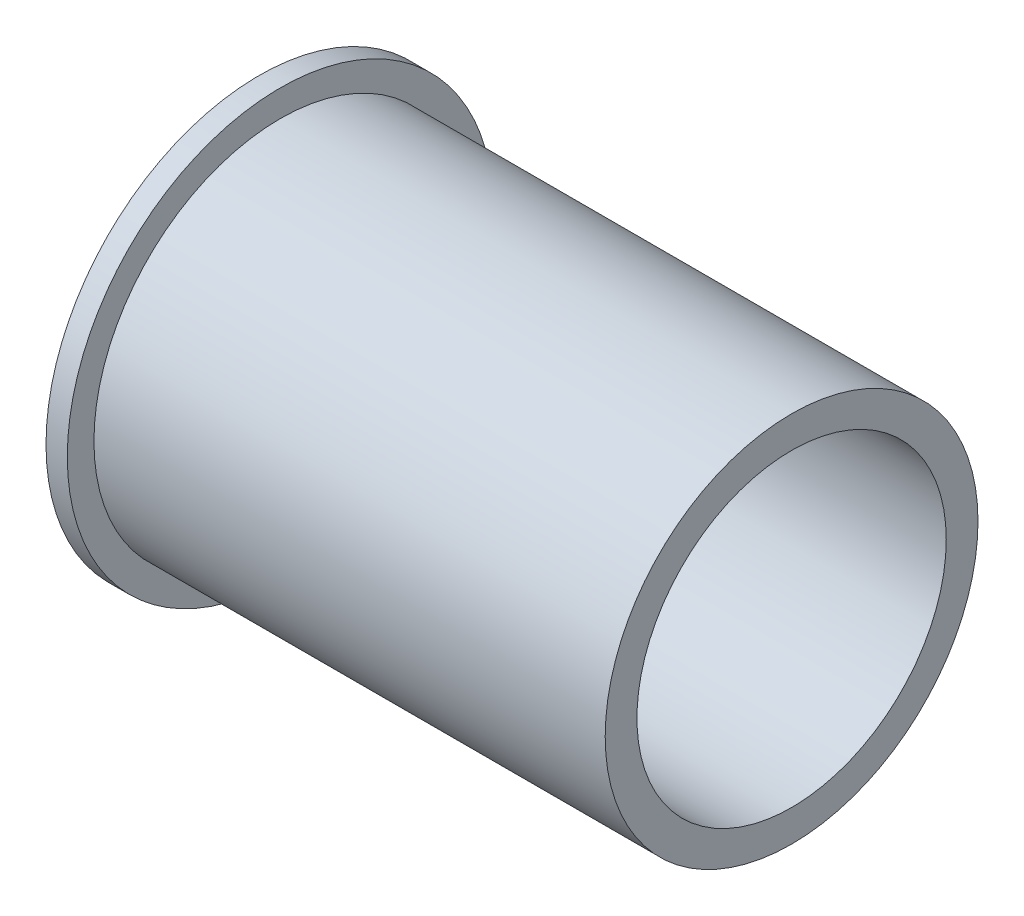
ISO-10303-21;
HEADER;
FILE_DESCRIPTION(('STEP AP214'),'2;1');
FILE_NAME('part.step','',(''),(''),'','','');
FILE_SCHEMA(('AUTOMOTIVE_DESIGN { 1 0 10303 214 1 1 1 1 }'));
ENDSEC;
DATA;
#1=APPLICATION_CONTEXT('core data for automotive mechanical design processes');
#2=APPLICATION_PROTOCOL_DEFINITION('international standard','automotive_design',2000,#1);
#3=PRODUCT_CONTEXT('',#1,'mechanical');
#4=PRODUCT('Part','Part','',(#3));
#5=PRODUCT_RELATED_PRODUCT_CATEGORY('part','',(#4));
#6=PRODUCT_DEFINITION_FORMATION('','',#4);
#7=PRODUCT_DEFINITION_CONTEXT('part definition',#1,'design');
#8=PRODUCT_DEFINITION('design','',#6,#7);
#9=PRODUCT_DEFINITION_SHAPE('','',#8);
#10=(LENGTH_UNIT() NAMED_UNIT(*) SI_UNIT(.MILLI.,.METRE.));
#11=(NAMED_UNIT(*) PLANE_ANGLE_UNIT() SI_UNIT($,.RADIAN.));
#12=(NAMED_UNIT(*) SI_UNIT($,.STERADIAN.) SOLID_ANGLE_UNIT());
#13=UNCERTAINTY_MEASURE_WITH_UNIT(LENGTH_MEASURE(1.E-05),#10,'distance_accuracy_value','');
#14=(GEOMETRIC_REPRESENTATION_CONTEXT(3) GLOBAL_UNCERTAINTY_ASSIGNED_CONTEXT((#13)) GLOBAL_UNIT_ASSIGNED_CONTEXT((#10,
#11,#12)) REPRESENTATION_CONTEXT('',''));
#15=CARTESIAN_POINT('',(0.,0.,0.));
#16=DIRECTION('',(0.,0.,1.));
#17=DIRECTION('',(1.,0.,0.));
#18=AXIS2_PLACEMENT_3D('',#15,#16,#17);
#19=CARTESIAN_POINT('',(31.75,0.,0.));
#20=DIRECTION('',(-1.,0.,0.));
#21=DIRECTION('',(0.,0.,1.));
#22=AXIS2_PLACEMENT_3D('',#19,#20,#21);
#23=CYLINDRICAL_SURFACE('',#22,11.1125);
#24=CARTESIAN_POINT('',(31.75,0.,0.));
#25=DIRECTION('',(1.,0.,0.));
#26=DIRECTION('',(0.,0.,-1.));
#27=AXIS2_PLACEMENT_3D('',#24,#25,#26);
#28=CIRCLE('',#27,11.1125);
#29=CARTESIAN_POINT('',(31.75,0.,-11.1125));
#30=VERTEX_POINT('',#29);
#31=EDGE_CURVE('E37',#30,#30,#28,.T.);
#32=ORIENTED_EDGE('',*,*,#31,.F.);
#33=EDGE_LOOP('',(#32));
#34=FACE_BOUND('',#33,.T.);
#35=CARTESIAN_POINT('',(1.27,0.,0.));
#36=DIRECTION('',(-1.,0.,0.));
#37=DIRECTION('',(0.,0.,1.));
#38=AXIS2_PLACEMENT_3D('',#35,#36,#37);
#39=CIRCLE('',#38,11.1125);
#40=CARTESIAN_POINT('',(1.27,0.,11.1125));
#41=VERTEX_POINT('',#40);
#42=EDGE_CURVE('E10',#41,#41,#39,.T.);
#43=ORIENTED_EDGE('',*,*,#42,.F.);
#44=EDGE_LOOP('',(#43));
#45=FACE_BOUND('',#44,.T.);
#46=ADVANCED_FACE('F31',(#34,#45),#23,.T.);
#47=CARTESIAN_POINT('',(31.75,0.,0.));
#48=DIRECTION('',(1.,0.,0.));
#49=DIRECTION('',(0.,0.,-1.));
#50=AXIS2_PLACEMENT_3D('',#47,#48,#49);
#51=PLANE('',#50);
#52=ORIENTED_EDGE('',*,*,#31,.T.);
#53=EDGE_LOOP('',(#52));
#54=FACE_BOUND('',#53,.T.);
#55=CARTESIAN_POINT('',(31.75,0.,0.));
#56=DIRECTION('',(1.,0.,0.));
#57=DIRECTION('',(0.,0.,-1.));
#58=AXIS2_PLACEMENT_3D('',#55,#56,#57);
#59=CIRCLE('',#58,9.2202);
#60=CARTESIAN_POINT('',(31.75,0.,-9.2202));
#61=VERTEX_POINT('',#60);
#62=EDGE_CURVE('E41',#61,#61,#59,.T.);
#63=ORIENTED_EDGE('',*,*,#62,.F.);
#64=EDGE_LOOP('',(#63));
#65=FACE_BOUND('',#64,.T.);
#66=ADVANCED_FACE('F69',(#54,#65),#51,.T.);
#67=CARTESIAN_POINT('',(0.,0.,0.));
#68=DIRECTION('',(1.,0.,0.));
#69=DIRECTION('',(0.,0.,-1.));
#70=AXIS2_PLACEMENT_3D('',#67,#68,#69);
#71=PLANE('',#70);
#72=CARTESIAN_POINT('',(0.,0.,0.));
#73=DIRECTION('',(1.,0.,0.));
#74=DIRECTION('',(0.,0.,-1.));
#75=AXIS2_PLACEMENT_3D('',#72,#73,#74);
#76=CIRCLE('',#75,9.2202);
#77=CARTESIAN_POINT('',(0.,0.,-9.2202));
#78=VERTEX_POINT('',#77);
#79=EDGE_CURVE('E45',#78,#78,#76,.T.);
#80=ORIENTED_EDGE('',*,*,#79,.T.);
#81=EDGE_LOOP('',(#80));
#82=FACE_BOUND('',#81,.T.);
#83=CARTESIAN_POINT('',(0.,0.,0.));
#84=DIRECTION('',(-1.,0.,0.));
#85=DIRECTION('',(0.,0.,1.));
#86=AXIS2_PLACEMENT_3D('',#83,#84,#85);
#87=CIRCLE('',#86,12.7);
#88=CARTESIAN_POINT('',(0.,0.,12.7));
#89=VERTEX_POINT('',#88);
#90=EDGE_CURVE('E51',#89,#89,#87,.T.);
#91=ORIENTED_EDGE('',*,*,#90,.T.);
#92=EDGE_LOOP('',(#91));
#93=FACE_BOUND('',#92,.T.);
#94=ADVANCED_FACE('F74',(#82,#93),#71,.F.);
#95=CARTESIAN_POINT('',(31.75,0.,0.));
#96=DIRECTION('',(-1.,0.,0.));
#97=DIRECTION('',(0.,0.,1.));
#98=AXIS2_PLACEMENT_3D('',#95,#96,#97);
#99=CYLINDRICAL_SURFACE('',#98,9.2202);
#100=ORIENTED_EDGE('',*,*,#62,.T.);
#101=EDGE_LOOP('',(#100));
#102=FACE_BOUND('',#101,.T.);
#103=ORIENTED_EDGE('',*,*,#79,.F.);
#104=EDGE_LOOP('',(#103));
#105=FACE_BOUND('',#104,.T.);
#106=ADVANCED_FACE('F66',(#102,#105),#99,.F.);
#107=CARTESIAN_POINT('',(1.27,0.,0.));
#108=DIRECTION('',(-1.,0.,0.));
#109=DIRECTION('',(0.,0.,1.));
#110=AXIS2_PLACEMENT_3D('',#107,#108,#109);
#111=CYLINDRICAL_SURFACE('',#110,12.7);
#112=CARTESIAN_POINT('',(1.27,0.,0.));
#113=DIRECTION('',(-1.,0.,0.));
#114=DIRECTION('',(0.,0.,1.));
#115=AXIS2_PLACEMENT_3D('',#112,#113,#114);
#116=CIRCLE('',#115,12.7);
#117=CARTESIAN_POINT('',(1.27,0.,12.7));
#118=VERTEX_POINT('',#117);
#119=EDGE_CURVE('E49',#118,#118,#116,.T.);
#120=ORIENTED_EDGE('',*,*,#119,.T.);
#121=EDGE_LOOP('',(#120));
#122=FACE_BOUND('',#121,.T.);
#123=ORIENTED_EDGE('',*,*,#90,.F.);
#124=EDGE_LOOP('',(#123));
#125=FACE_BOUND('',#124,.T.);
#126=ADVANCED_FACE('F57',(#122,#125),#111,.T.);
#127=CARTESIAN_POINT('',(1.27,0.,0.));
#128=DIRECTION('',(-1.,0.,0.));
#129=DIRECTION('',(0.,0.,1.));
#130=AXIS2_PLACEMENT_3D('',#127,#128,#129);
#131=PLANE('',#130);
#132=ORIENTED_EDGE('',*,*,#42,.T.);
#133=EDGE_LOOP('',(#132));
#134=FACE_BOUND('',#133,.T.);
#135=ORIENTED_EDGE('',*,*,#119,.F.);
#136=EDGE_LOOP('',(#135));
#137=FACE_BOUND('',#136,.T.);
#138=ADVANCED_FACE('F60',(#134,#137),#131,.F.);
#139=CLOSED_SHELL('',(#46,#66,#94,#106,#126,#138));
#140=MANIFOLD_SOLID_BREP('B2',#139);
#141=ADVANCED_BREP_SHAPE_REPRESENTATION('',(#18,#140),#14);
#142=SHAPE_DEFINITION_REPRESENTATION(#9,#141);
ENDSEC;
END-ISO-10303-21;
